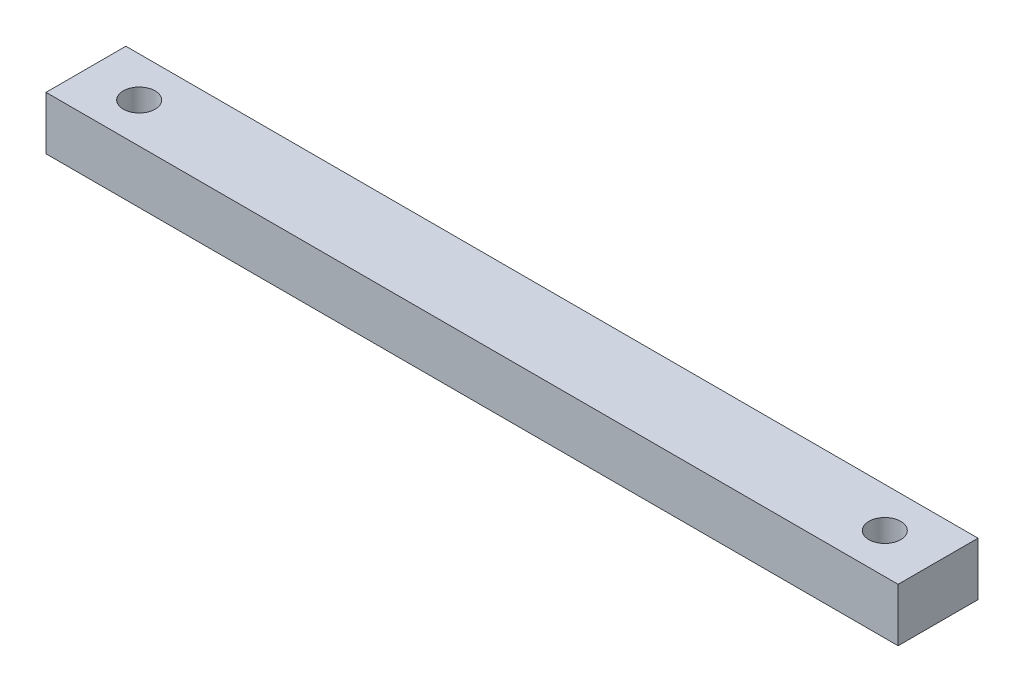
ISO-10303-21;
HEADER;
FILE_DESCRIPTION(('STEP AP214'),'2;1');
FILE_NAME('part.step','',(''),(''),'','','');
FILE_SCHEMA(('AUTOMOTIVE_DESIGN { 1 0 10303 214 1 1 1 1 }'));
ENDSEC;
DATA;
#1=APPLICATION_CONTEXT('core data for automotive mechanical design processes');
#2=APPLICATION_PROTOCOL_DEFINITION('international standard','automotive_design',2000,#1);
#3=PRODUCT_CONTEXT('',#1,'mechanical');
#4=PRODUCT('Part','Part','',(#3));
#5=PRODUCT_RELATED_PRODUCT_CATEGORY('part','',(#4));
#6=PRODUCT_DEFINITION_FORMATION('','',#4);
#7=PRODUCT_DEFINITION_CONTEXT('part definition',#1,'design');
#8=PRODUCT_DEFINITION('design','',#6,#7);
#9=PRODUCT_DEFINITION_SHAPE('','',#8);
#10=(LENGTH_UNIT() NAMED_UNIT(*) SI_UNIT(.MILLI.,.METRE.));
#11=(NAMED_UNIT(*) PLANE_ANGLE_UNIT() SI_UNIT($,.RADIAN.));
#12=(NAMED_UNIT(*) SI_UNIT($,.STERADIAN.) SOLID_ANGLE_UNIT());
#13=UNCERTAINTY_MEASURE_WITH_UNIT(LENGTH_MEASURE(1.E-05),#10,'distance_accuracy_value','');
#14=(GEOMETRIC_REPRESENTATION_CONTEXT(3) GLOBAL_UNCERTAINTY_ASSIGNED_CONTEXT((#13)) GLOBAL_UNIT_ASSIGNED_CONTEXT((#10,
#11,#12)) REPRESENTATION_CONTEXT('',''));
#15=CARTESIAN_POINT('',(0.,0.,0.));
#16=DIRECTION('',(0.,0.,1.));
#17=DIRECTION('',(1.,0.,0.));
#18=AXIS2_PLACEMENT_3D('',#15,#16,#17);
#19=CARTESIAN_POINT('',(50.8,6.35,4.7625));
#20=DIRECTION('',(-1.,0.,0.));
#21=DIRECTION('',(0.,0.,1.));
#22=AXIS2_PLACEMENT_3D('',#19,#20,#21);
#23=PLANE('',#22);
#24=DIRECTION('',(0.,0.,-1.));
#25=VECTOR('',#24,1.);
#26=CARTESIAN_POINT('',(50.8,0.,4.7625));
#27=LINE('',#26,#25);
#28=CARTESIAN_POINT('',(50.8,0.,4.7625));
#29=VERTEX_POINT('',#28);
#30=CARTESIAN_POINT('',(50.8,0.,-4.7625));
#31=VERTEX_POINT('',#30);
#32=EDGE_CURVE('E96',#29,#31,#27,.T.);
#33=ORIENTED_EDGE('',*,*,#32,.T.);
#34=DIRECTION('',(0.,-1.,0.));
#35=VECTOR('',#34,1.);
#36=CARTESIAN_POINT('',(50.8,6.35,-4.7625));
#37=LINE('',#36,#35);
#38=CARTESIAN_POINT('',(50.8,6.35,-4.7625));
#39=VERTEX_POINT('',#38);
#40=EDGE_CURVE('E11',#39,#31,#37,.T.);
#41=ORIENTED_EDGE('',*,*,#40,.F.);
#42=DIRECTION('',(0.,0.,-1.));
#43=VECTOR('',#42,1.);
#44=CARTESIAN_POINT('',(50.8,6.35,4.7625));
#45=LINE('',#44,#43);
#46=CARTESIAN_POINT('',(50.8,6.35,4.7625));
#47=VERTEX_POINT('',#46);
#48=EDGE_CURVE('E84',#47,#39,#45,.T.);
#49=ORIENTED_EDGE('',*,*,#48,.F.);
#50=DIRECTION('',(0.,-1.,0.));
#51=VECTOR('',#50,1.);
#52=CARTESIAN_POINT('',(50.8,6.35,4.7625));
#53=LINE('',#52,#51);
#54=EDGE_CURVE('E92',#47,#29,#53,.T.);
#55=ORIENTED_EDGE('',*,*,#54,.T.);
#56=EDGE_LOOP('',(#33,#41,#49,#55));
#57=FACE_BOUND('',#56,.T.);
#58=ADVANCED_FACE('F33',(#57),#23,.F.);
#59=CARTESIAN_POINT('',(-50.8,6.35,-4.7625));
#60=DIRECTION('',(0.,0.,1.));
#61=DIRECTION('',(1.,0.,0.));
#62=AXIS2_PLACEMENT_3D('',#59,#60,#61);
#63=PLANE('',#62);
#64=DIRECTION('',(-1.,0.,0.));
#65=VECTOR('',#64,1.);
#66=CARTESIAN_POINT('',(-50.8,0.,-4.7625));
#67=LINE('',#66,#65);
#68=CARTESIAN_POINT('',(-50.8,0.,-4.7625));
#69=VERTEX_POINT('',#68);
#70=EDGE_CURVE('E88',#31,#69,#67,.T.);
#71=ORIENTED_EDGE('',*,*,#70,.T.);
#72=DIRECTION('',(0.,-1.,0.));
#73=VECTOR('',#72,1.);
#74=CARTESIAN_POINT('',(-50.8,6.35,-4.7625));
#75=LINE('',#74,#73);
#76=CARTESIAN_POINT('',(-50.8,6.35,-4.7625));
#77=VERTEX_POINT('',#76);
#78=EDGE_CURVE('E41',#77,#69,#75,.T.);
#79=ORIENTED_EDGE('',*,*,#78,.F.);
#80=DIRECTION('',(-1.,0.,0.));
#81=VECTOR('',#80,1.);
#82=CARTESIAN_POINT('',(-50.8,6.35,-4.7625));
#83=LINE('',#82,#81);
#84=EDGE_CURVE('E79',#39,#77,#83,.T.);
#85=ORIENTED_EDGE('',*,*,#84,.F.);
#86=ORIENTED_EDGE('',*,*,#40,.T.);
#87=EDGE_LOOP('',(#71,#79,#85,#86));
#88=FACE_BOUND('',#87,.T.);
#89=ADVANCED_FACE('F87',(#88),#63,.F.);
#90=CARTESIAN_POINT('',(-50.8,6.35,4.7625));
#91=DIRECTION('',(1.,0.,0.));
#92=DIRECTION('',(0.,0.,-1.));
#93=AXIS2_PLACEMENT_3D('',#90,#91,#92);
#94=PLANE('',#93);
#95=DIRECTION('',(0.,0.,1.));
#96=VECTOR('',#95,1.);
#97=CARTESIAN_POINT('',(-50.8,0.,4.7625));
#98=LINE('',#97,#96);
#99=CARTESIAN_POINT('',(-50.8,0.,4.7625));
#100=VERTEX_POINT('',#99);
#101=EDGE_CURVE('E66',#69,#100,#98,.T.);
#102=ORIENTED_EDGE('',*,*,#101,.T.);
#103=DIRECTION('',(0.,-1.,0.));
#104=VECTOR('',#103,1.);
#105=CARTESIAN_POINT('',(-50.8,6.35,4.7625));
#106=LINE('',#105,#104);
#107=CARTESIAN_POINT('',(-50.8,6.35,4.7625));
#108=VERTEX_POINT('',#107);
#109=EDGE_CURVE('E89',#108,#100,#106,.T.);
#110=ORIENTED_EDGE('',*,*,#109,.F.);
#111=DIRECTION('',(0.,0.,1.));
#112=VECTOR('',#111,1.);
#113=CARTESIAN_POINT('',(-50.8,6.35,4.7625));
#114=LINE('',#113,#112);
#115=EDGE_CURVE('E82',#77,#108,#114,.T.);
#116=ORIENTED_EDGE('',*,*,#115,.F.);
#117=ORIENTED_EDGE('',*,*,#78,.T.);
#118=EDGE_LOOP('',(#102,#110,#116,#117));
#119=FACE_BOUND('',#118,.T.);
#120=ADVANCED_FACE('F90',(#119),#94,.F.);
#121=CARTESIAN_POINT('',(-50.8,6.35,4.7625));
#122=DIRECTION('',(0.,0.,-1.));
#123=DIRECTION('',(-1.,0.,0.));
#124=AXIS2_PLACEMENT_3D('',#121,#122,#123);
#125=PLANE('',#124);
#126=DIRECTION('',(1.,0.,0.));
#127=VECTOR('',#126,1.);
#128=CARTESIAN_POINT('',(-50.8,0.,4.7625));
#129=LINE('',#128,#127);
#130=EDGE_CURVE('E72',#100,#29,#129,.T.);
#131=ORIENTED_EDGE('',*,*,#130,.T.);
#132=ORIENTED_EDGE('',*,*,#54,.F.);
#133=DIRECTION('',(1.,0.,0.));
#134=VECTOR('',#133,1.);
#135=CARTESIAN_POINT('',(-50.8,6.35,4.7625));
#136=LINE('',#135,#134);
#137=EDGE_CURVE('E49',#108,#47,#136,.T.);
#138=ORIENTED_EDGE('',*,*,#137,.F.);
#139=ORIENTED_EDGE('',*,*,#109,.T.);
#140=EDGE_LOOP('',(#131,#132,#138,#139));
#141=FACE_BOUND('',#140,.T.);
#142=ADVANCED_FACE('F104',(#141),#125,.F.);
#143=CARTESIAN_POINT('',(0.,6.35,0.));
#144=DIRECTION('',(0.,-1.,0.));
#145=DIRECTION('',(0.,0.,-1.));
#146=AXIS2_PLACEMENT_3D('',#143,#144,#145);
#147=PLANE('',#146);
#148=CARTESIAN_POINT('',(-44.45,6.35,0.));
#149=DIRECTION('',(0.,1.,0.));
#150=DIRECTION('',(0.,0.,1.));
#151=AXIS2_PLACEMENT_3D('',#148,#149,#150);
#152=CIRCLE('',#151,1.89864999999999);
#153=CARTESIAN_POINT('',(-44.45,6.35,1.89864999999999));
#154=VERTEX_POINT('',#153);
#155=EDGE_CURVE('E118',#154,#154,#152,.T.);
#156=ORIENTED_EDGE('',*,*,#155,.F.);
#157=EDGE_LOOP('',(#156));
#158=FACE_BOUND('',#157,.T.);
#159=CARTESIAN_POINT('',(44.45,6.35,0.));
#160=DIRECTION('',(0.,1.,0.));
#161=DIRECTION('',(0.,0.,1.));
#162=AXIS2_PLACEMENT_3D('',#159,#160,#161);
#163=CIRCLE('',#162,1.89864999999999);
#164=CARTESIAN_POINT('',(44.45,6.35,1.89864999999999));
#165=VERTEX_POINT('',#164);
#166=EDGE_CURVE('E112',#165,#165,#163,.T.);
#167=ORIENTED_EDGE('',*,*,#166,.F.);
#168=EDGE_LOOP('',(#167));
#169=FACE_BOUND('',#168,.T.);
#170=ORIENTED_EDGE('',*,*,#48,.T.);
#171=ORIENTED_EDGE('',*,*,#84,.T.);
#172=ORIENTED_EDGE('',*,*,#115,.T.);
#173=ORIENTED_EDGE('',*,*,#137,.T.);
#174=EDGE_LOOP('',(#170,#171,#172,#173));
#175=FACE_BOUND('',#174,.T.);
#176=ADVANCED_FACE('F80',(#158,#169,#175),#147,.F.);
#177=CARTESIAN_POINT('',(0.,0.,0.));
#178=DIRECTION('',(0.,-1.,0.));
#179=DIRECTION('',(0.,0.,-1.));
#180=AXIS2_PLACEMENT_3D('',#177,#178,#179);
#181=PLANE('',#180);
#182=CARTESIAN_POINT('',(-44.45,0.,0.));
#183=DIRECTION('',(0.,1.,0.));
#184=DIRECTION('',(0.,0.,1.));
#185=AXIS2_PLACEMENT_3D('',#182,#183,#184);
#186=CIRCLE('',#185,1.89864999999999);
#187=CARTESIAN_POINT('',(-44.45,0.,1.89864999999999));
#188=VERTEX_POINT('',#187);
#189=EDGE_CURVE('E115',#188,#188,#186,.T.);
#190=ORIENTED_EDGE('',*,*,#189,.T.);
#191=EDGE_LOOP('',(#190));
#192=FACE_BOUND('',#191,.T.);
#193=CARTESIAN_POINT('',(44.45,0.,0.));
#194=DIRECTION('',(0.,1.,0.));
#195=DIRECTION('',(0.,0.,1.));
#196=AXIS2_PLACEMENT_3D('',#193,#194,#195);
#197=CIRCLE('',#196,1.89864999999999);
#198=CARTESIAN_POINT('',(44.45,0.,1.89864999999999));
#199=VERTEX_POINT('',#198);
#200=EDGE_CURVE('E99',#199,#199,#197,.T.);
#201=ORIENTED_EDGE('',*,*,#200,.T.);
#202=EDGE_LOOP('',(#201));
#203=FACE_BOUND('',#202,.T.);
#204=ORIENTED_EDGE('',*,*,#32,.F.);
#205=ORIENTED_EDGE('',*,*,#130,.F.);
#206=ORIENTED_EDGE('',*,*,#101,.F.);
#207=ORIENTED_EDGE('',*,*,#70,.F.);
#208=EDGE_LOOP('',(#204,#205,#206,#207));
#209=FACE_BOUND('',#208,.T.);
#210=ADVANCED_FACE('F107',(#192,#203,#209),#181,.T.);
#211=CARTESIAN_POINT('',(44.45,6.35,0.));
#212=DIRECTION('',(0.,1.,0.));
#213=DIRECTION('',(0.,0.,1.));
#214=AXIS2_PLACEMENT_3D('',#211,#212,#213);
#215=CYLINDRICAL_SURFACE('',#214,1.89864999999999);
#216=ORIENTED_EDGE('',*,*,#200,.F.);
#217=EDGE_LOOP('',(#216));
#218=FACE_BOUND('',#217,.T.);
#219=ORIENTED_EDGE('',*,*,#166,.T.);
#220=EDGE_LOOP('',(#219));
#221=FACE_BOUND('',#220,.T.);
#222=ADVANCED_FACE('F129',(#218,#221),#215,.F.);
#223=CARTESIAN_POINT('',(-44.45,6.35,0.));
#224=DIRECTION('',(0.,1.,0.));
#225=DIRECTION('',(0.,0.,1.));
#226=AXIS2_PLACEMENT_3D('',#223,#224,#225);
#227=CYLINDRICAL_SURFACE('',#226,1.89864999999999);
#228=ORIENTED_EDGE('',*,*,#189,.F.);
#229=EDGE_LOOP('',(#228));
#230=FACE_BOUND('',#229,.T.);
#231=ORIENTED_EDGE('',*,*,#155,.T.);
#232=EDGE_LOOP('',(#231));
#233=FACE_BOUND('',#232,.T.);
#234=ADVANCED_FACE('F122',(#230,#233),#227,.F.);
#235=CLOSED_SHELL('',(#58,#89,#120,#142,#176,#210,#222,#234));
#236=MANIFOLD_SOLID_BREP('B2',#235);
#237=ADVANCED_BREP_SHAPE_REPRESENTATION('',(#18,#236),#14);
#238=SHAPE_DEFINITION_REPRESENTATION(#9,#237);
ENDSEC;
END-ISO-10303-21;
